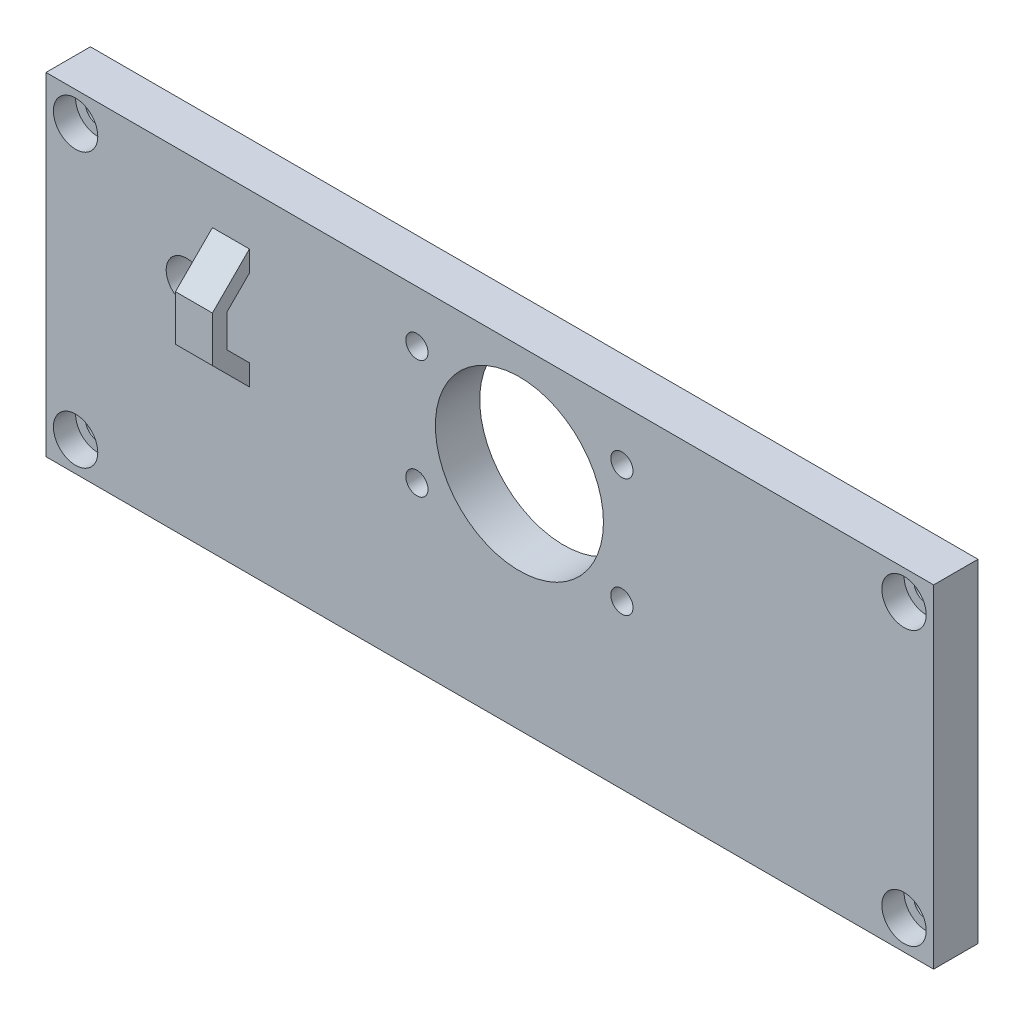
ISO-10303-21;
HEADER;
FILE_DESCRIPTION(('STEP AP214'),'2;1');
FILE_NAME('part.step','',(''),(''),'','','');
FILE_SCHEMA(('AUTOMOTIVE_DESIGN { 1 0 10303 214 1 1 1 1 }'));
ENDSEC;
DATA;
#1=APPLICATION_CONTEXT('core data for automotive mechanical design processes');
#2=APPLICATION_PROTOCOL_DEFINITION('international standard','automotive_design',2000,#1);
#3=PRODUCT_CONTEXT('',#1,'mechanical');
#4=PRODUCT('Part','Part','',(#3));
#5=PRODUCT_RELATED_PRODUCT_CATEGORY('part','',(#4));
#6=PRODUCT_DEFINITION_FORMATION('','',#4);
#7=PRODUCT_DEFINITION_CONTEXT('part definition',#1,'design');
#8=PRODUCT_DEFINITION('design','',#6,#7);
#9=PRODUCT_DEFINITION_SHAPE('','',#8);
#10=(LENGTH_UNIT() NAMED_UNIT(*) SI_UNIT(.MILLI.,.METRE.));
#11=(NAMED_UNIT(*) PLANE_ANGLE_UNIT() SI_UNIT($,.RADIAN.));
#12=(NAMED_UNIT(*) SI_UNIT($,.STERADIAN.) SOLID_ANGLE_UNIT());
#13=UNCERTAINTY_MEASURE_WITH_UNIT(LENGTH_MEASURE(1.E-05),#10,'distance_accuracy_value','');
#14=(GEOMETRIC_REPRESENTATION_CONTEXT(3) GLOBAL_UNCERTAINTY_ASSIGNED_CONTEXT((#13)) GLOBAL_UNIT_ASSIGNED_CONTEXT((#10,
#11,#12)) REPRESENTATION_CONTEXT('',''));
#15=CARTESIAN_POINT('',(0.,0.,0.));
#16=DIRECTION('',(0.,0.,1.));
#17=DIRECTION('',(1.,0.,0.));
#18=AXIS2_PLACEMENT_3D('',#15,#16,#17);
#19=CARTESIAN_POINT('',(0.,0.,6.));
#20=DIRECTION('',(0.,0.,-1.));
#21=DIRECTION('',(-1.,0.,0.));
#22=AXIS2_PLACEMENT_3D('',#19,#20,#21);
#23=PLANE('',#22);
#24=DIRECTION('',(0.,-1.,0.));
#25=VECTOR('',#24,1.);
#26=CARTESIAN_POINT('',(27.5,38.0784271247462,6.));
#27=LINE('',#26,#25);
#28=CARTESIAN_POINT('',(27.5,38.0784271247462,6.));
#29=VERTEX_POINT('',#28);
#30=CARTESIAN_POINT('',(27.5,35.25,6.));
#31=VERTEX_POINT('',#30);
#32=EDGE_CURVE('E151',#29,#31,#27,.T.);
#33=ORIENTED_EDGE('',*,*,#32,.T.);
#34=DIRECTION('',(-1.,0.,0.));
#35=VECTOR('',#34,1.);
#36=CARTESIAN_POINT('',(27.5,35.25,6.));
#37=LINE('',#36,#35);
#38=CARTESIAN_POINT('',(22.5,35.25,6.));
#39=VERTEX_POINT('',#38);
#40=EDGE_CURVE('E134',#31,#39,#37,.T.);
#41=ORIENTED_EDGE('',*,*,#40,.T.);
#42=DIRECTION('',(0.,-1.,0.));
#43=VECTOR('',#42,1.);
#44=CARTESIAN_POINT('',(22.5,38.0784271247462,6.));
#45=LINE('',#44,#43);
#46=CARTESIAN_POINT('',(22.5,38.0784271247462,6.));
#47=VERTEX_POINT('',#46);
#48=EDGE_CURVE('E176',#47,#39,#45,.T.);
#49=ORIENTED_EDGE('',*,*,#48,.F.);
#50=DIRECTION('',(-1.,0.,0.));
#51=VECTOR('',#50,1.);
#52=CARTESIAN_POINT('',(27.5,38.0784271247462,6.));
#53=LINE('',#52,#51);
#54=EDGE_CURVE('E158',#29,#47,#53,.T.);
#55=ORIENTED_EDGE('',*,*,#54,.F.);
#56=EDGE_LOOP('',(#33,#41,#49,#55));
#57=FACE_BOUND('',#56,.T.);
#58=CARTESIAN_POINT('',(19.,30.,6.));
#59=DIRECTION('',(0.,0.,1.));
#60=DIRECTION('',(1.,0.,0.));
#61=AXIS2_PLACEMENT_3D('',#58,#59,#60);
#62=CIRCLE('',#61,2.74999999999999);
#63=CARTESIAN_POINT('',(21.75,30.,6.));
#64=VERTEX_POINT('',#63);
#65=EDGE_CURVE('E189',#64,#64,#62,.T.);
#66=ORIENTED_EDGE('',*,*,#65,.F.);
#67=EDGE_LOOP('',(#66));
#68=FACE_BOUND('',#67,.T.);
#69=CARTESIAN_POINT('',(116.,41.,6.));
#70=DIRECTION('',(0.,0.,1.));
#71=DIRECTION('',(1.,0.,0.));
#72=AXIS2_PLACEMENT_3D('',#69,#70,#71);
#73=CIRCLE('',#72,3.00000000000001);
#74=CARTESIAN_POINT('',(119.,41.,6.));
#75=VERTEX_POINT('',#74);
#76=EDGE_CURVE('E229',#75,#75,#73,.T.);
#77=ORIENTED_EDGE('',*,*,#76,.F.);
#78=EDGE_LOOP('',(#77));
#79=FACE_BOUND('',#78,.T.);
#80=CARTESIAN_POINT('',(116.,4.,6.));
#81=DIRECTION('',(0.,0.,1.));
#82=DIRECTION('',(1.,0.,0.));
#83=AXIS2_PLACEMENT_3D('',#80,#81,#82);
#84=CIRCLE('',#83,3.00000000000001);
#85=CARTESIAN_POINT('',(119.,4.,6.));
#86=VERTEX_POINT('',#85);
#87=EDGE_CURVE('E220',#86,#86,#84,.T.);
#88=ORIENTED_EDGE('',*,*,#87,.F.);
#89=EDGE_LOOP('',(#88));
#90=FACE_BOUND('',#89,.T.);
#91=CARTESIAN_POINT('',(4.,4.,6.));
#92=DIRECTION('',(0.,0.,1.));
#93=DIRECTION('',(1.,0.,0.));
#94=AXIS2_PLACEMENT_3D('',#91,#92,#93);
#95=CIRCLE('',#94,3.);
#96=CARTESIAN_POINT('',(7.,4.,6.));
#97=VERTEX_POINT('',#96);
#98=EDGE_CURVE('E209',#97,#97,#95,.T.);
#99=ORIENTED_EDGE('',*,*,#98,.F.);
#100=EDGE_LOOP('',(#99));
#101=FACE_BOUND('',#100,.T.);
#102=CARTESIAN_POINT('',(4.,41.,6.));
#103=DIRECTION('',(0.,0.,1.));
#104=DIRECTION('',(1.,0.,0.));
#105=AXIS2_PLACEMENT_3D('',#102,#103,#104);
#106=CIRCLE('',#105,3.);
#107=CARTESIAN_POINT('',(7.,41.,6.));
#108=VERTEX_POINT('',#107);
#109=EDGE_CURVE('E238',#108,#108,#106,.T.);
#110=ORIENTED_EDGE('',*,*,#109,.F.);
#111=EDGE_LOOP('',(#110));
#112=FACE_BOUND('',#111,.T.);
#113=DIRECTION('',(0.,-1.,0.));
#114=VECTOR('',#113,1.);
#115=CARTESIAN_POINT('',(0.,0.,6.));
#116=LINE('',#115,#114);
#117=CARTESIAN_POINT('',(0.,45.,6.));
#118=VERTEX_POINT('',#117);
#119=CARTESIAN_POINT('',(0.,0.,6.));
#120=VERTEX_POINT('',#119);
#121=EDGE_CURVE('E287',#118,#120,#116,.T.);
#122=ORIENTED_EDGE('',*,*,#121,.T.);
#123=DIRECTION('',(1.,0.,0.));
#124=VECTOR('',#123,1.);
#125=CARTESIAN_POINT('',(0.,0.,6.));
#126=LINE('',#125,#124);
#127=CARTESIAN_POINT('',(120.,0.,6.));
#128=VERTEX_POINT('',#127);
#129=EDGE_CURVE('E290',#120,#128,#126,.T.);
#130=ORIENTED_EDGE('',*,*,#129,.T.);
#131=DIRECTION('',(0.,1.,0.));
#132=VECTOR('',#131,1.);
#133=CARTESIAN_POINT('',(120.,0.,6.));
#134=LINE('',#133,#132);
#135=CARTESIAN_POINT('',(120.,45.,6.));
#136=VERTEX_POINT('',#135);
#137=EDGE_CURVE('E293',#128,#136,#134,.T.);
#138=ORIENTED_EDGE('',*,*,#137,.T.);
#139=DIRECTION('',(-1.,0.,0.));
#140=VECTOR('',#139,1.);
#141=CARTESIAN_POINT('',(0.,45.,6.));
#142=LINE('',#141,#140);
#143=EDGE_CURVE('E295',#136,#118,#142,.T.);
#144=ORIENTED_EDGE('',*,*,#143,.T.);
#145=EDGE_LOOP('',(#122,#130,#138,#144));
#146=FACE_BOUND('',#145,.T.);
#147=CARTESIAN_POINT('',(64.,30.,6.));
#148=DIRECTION('',(0.,0.,1.));
#149=DIRECTION('',(1.,0.,0.));
#150=AXIS2_PLACEMENT_3D('',#147,#148,#149);
#151=CIRCLE('',#150,11.3625);
#152=CARTESIAN_POINT('',(75.3625,30.,6.));
#153=VERTEX_POINT('',#152);
#154=EDGE_CURVE('E281',#153,#153,#151,.T.);
#155=ORIENTED_EDGE('',*,*,#154,.F.);
#156=EDGE_LOOP('',(#155));
#157=FACE_BOUND('',#156,.T.);
#158=CARTESIAN_POINT('',(50.143593539449,38.,6.));
#159=DIRECTION('',(0.,0.,1.));
#160=DIRECTION('',(1.,0.,0.));
#161=AXIS2_PLACEMENT_3D('',#158,#159,#160);
#162=CIRCLE('',#161,1.5);
#163=CARTESIAN_POINT('',(51.643593539449,38.,6.));
#164=VERTEX_POINT('',#163);
#165=EDGE_CURVE('E263',#164,#164,#162,.T.);
#166=ORIENTED_EDGE('',*,*,#165,.F.);
#167=EDGE_LOOP('',(#166));
#168=FACE_BOUND('',#167,.T.);
#169=CARTESIAN_POINT('',(50.143593539449,22.,6.));
#170=DIRECTION('',(0.,0.,1.));
#171=DIRECTION('',(-1.,0.,0.));
#172=AXIS2_PLACEMENT_3D('',#169,#170,#171);
#173=CIRCLE('',#172,1.5);
#174=CARTESIAN_POINT('',(48.643593539449,22.,6.));
#175=VERTEX_POINT('',#174);
#176=EDGE_CURVE('E257',#175,#175,#173,.T.);
#177=ORIENTED_EDGE('',*,*,#176,.F.);
#178=EDGE_LOOP('',(#177));
#179=FACE_BOUND('',#178,.T.);
#180=CARTESIAN_POINT('',(77.856406460551,22.,6.));
#181=DIRECTION('',(0.,0.,1.));
#182=DIRECTION('',(1.,0.,0.));
#183=AXIS2_PLACEMENT_3D('',#180,#181,#182);
#184=CIRCLE('',#183,1.50000000000001);
#185=CARTESIAN_POINT('',(79.3564064605511,22.,6.));
#186=VERTEX_POINT('',#185);
#187=EDGE_CURVE('E251',#186,#186,#184,.T.);
#188=ORIENTED_EDGE('',*,*,#187,.F.);
#189=EDGE_LOOP('',(#188));
#190=FACE_BOUND('',#189,.T.);
#191=CARTESIAN_POINT('',(77.856406460551,38.,6.));
#192=DIRECTION('',(0.,0.,1.));
#193=DIRECTION('',(-1.,0.,0.));
#194=AXIS2_PLACEMENT_3D('',#191,#192,#193);
#195=CIRCLE('',#194,1.50000000000001);
#196=CARTESIAN_POINT('',(76.356406460551,38.,6.));
#197=VERTEX_POINT('',#196);
#198=EDGE_CURVE('E245',#197,#197,#195,.T.);
#199=ORIENTED_EDGE('',*,*,#198,.F.);
#200=EDGE_LOOP('',(#199));
#201=FACE_BOUND('',#200,.T.);
#202=DIRECTION('',(0.,-1.,0.));
#203=VECTOR('',#202,1.);
#204=CARTESIAN_POINT('',(27.5,24.75,6.));
#205=LINE('',#204,#203);
#206=CARTESIAN_POINT('',(27.5,24.75,6.));
#207=VERTEX_POINT('',#206);
#208=CARTESIAN_POINT('',(27.5,21.9215728752538,6.));
#209=VERTEX_POINT('',#208);
#210=EDGE_CURVE('E167',#207,#209,#205,.T.);
#211=ORIENTED_EDGE('',*,*,#210,.T.);
#212=DIRECTION('',(-1.,0.,0.));
#213=VECTOR('',#212,1.);
#214=CARTESIAN_POINT('',(27.5,21.9215728752538,6.));
#215=LINE('',#214,#213);
#216=CARTESIAN_POINT('',(22.5,21.9215728752538,6.));
#217=VERTEX_POINT('',#216);
#218=EDGE_CURVE('E195',#209,#217,#215,.T.);
#219=ORIENTED_EDGE('',*,*,#218,.T.);
#220=DIRECTION('',(0.,-1.,0.));
#221=VECTOR('',#220,1.);
#222=CARTESIAN_POINT('',(22.5,24.75,6.));
#223=LINE('',#222,#221);
#224=CARTESIAN_POINT('',(22.5,24.75,6.));
#225=VERTEX_POINT('',#224);
#226=EDGE_CURVE('E182',#225,#217,#223,.T.);
#227=ORIENTED_EDGE('',*,*,#226,.F.);
#228=DIRECTION('',(-1.,0.,0.));
#229=VECTOR('',#228,1.);
#230=CARTESIAN_POINT('',(27.5,24.75,6.));
#231=LINE('',#230,#229);
#232=EDGE_CURVE('E198',#207,#225,#231,.T.);
#233=ORIENTED_EDGE('',*,*,#232,.F.);
#234=EDGE_LOOP('',(#211,#219,#227,#233));
#235=FACE_BOUND('',#234,.T.);
#236=ADVANCED_FACE('F43',(#57,#68,#79,#90,#101,#112,#146,#157,#168,#179,#190,#201,#235),#23,.F.);
#237=CARTESIAN_POINT('',(4.,41.,6.));
#238=DIRECTION('',(0.,0.,-1.));
#239=DIRECTION('',(-1.,0.,0.));
#240=AXIS2_PLACEMENT_3D('',#237,#238,#239);
#241=CYLINDRICAL_SURFACE('',#240,1.65);
#242=CARTESIAN_POINT('',(4.,41.,0.));
#243=DIRECTION('',(0.,0.,1.));
#244=DIRECTION('',(1.,0.,0.));
#245=AXIS2_PLACEMENT_3D('',#242,#243,#244);
#246=CIRCLE('',#245,1.65);
#247=CARTESIAN_POINT('',(5.65,41.,0.));
#248=VERTEX_POINT('',#247);
#249=EDGE_CURVE('E277',#248,#248,#246,.T.);
#250=ORIENTED_EDGE('',*,*,#249,.F.);
#251=EDGE_LOOP('',(#250));
#252=FACE_BOUND('',#251,.T.);
#253=CARTESIAN_POINT('',(4.,41.,3.));
#254=DIRECTION('',(0.,0.,1.));
#255=DIRECTION('',(1.,0.,0.));
#256=AXIS2_PLACEMENT_3D('',#253,#254,#255);
#257=CIRCLE('',#256,1.65);
#258=CARTESIAN_POINT('',(5.65,41.,3.));
#259=VERTEX_POINT('',#258);
#260=EDGE_CURVE('E219',#259,#259,#257,.T.);
#261=ORIENTED_EDGE('',*,*,#260,.T.);
#262=EDGE_LOOP('',(#261));
#263=FACE_BOUND('',#262,.T.);
#264=ADVANCED_FACE('F339',(#252,#263),#241,.F.);
#265=CARTESIAN_POINT('',(4.,4.,6.));
#266=DIRECTION('',(0.,0.,-1.));
#267=DIRECTION('',(-1.,0.,0.));
#268=AXIS2_PLACEMENT_3D('',#265,#266,#267);
#269=CYLINDRICAL_SURFACE('',#268,1.65);
#270=CARTESIAN_POINT('',(4.,4.,0.));
#271=DIRECTION('',(0.,0.,1.));
#272=DIRECTION('',(-1.,0.,0.));
#273=AXIS2_PLACEMENT_3D('',#270,#271,#272);
#274=CIRCLE('',#273,1.65);
#275=CARTESIAN_POINT('',(2.35,4.,0.));
#276=VERTEX_POINT('',#275);
#277=EDGE_CURVE('E274',#276,#276,#274,.T.);
#278=ORIENTED_EDGE('',*,*,#277,.F.);
#279=EDGE_LOOP('',(#278));
#280=FACE_BOUND('',#279,.T.);
#281=CARTESIAN_POINT('',(4.,4.,3.));
#282=DIRECTION('',(0.,0.,1.));
#283=DIRECTION('',(1.,0.,0.));
#284=AXIS2_PLACEMENT_3D('',#281,#282,#283);
#285=CIRCLE('',#284,1.65);
#286=CARTESIAN_POINT('',(5.65,4.,3.));
#287=VERTEX_POINT('',#286);
#288=EDGE_CURVE('E212',#287,#287,#285,.T.);
#289=ORIENTED_EDGE('',*,*,#288,.T.);
#290=EDGE_LOOP('',(#289));
#291=FACE_BOUND('',#290,.T.);
#292=ADVANCED_FACE('F346',(#280,#291),#269,.F.);
#293=CARTESIAN_POINT('',(116.,41.,6.));
#294=DIRECTION('',(0.,0.,-1.));
#295=DIRECTION('',(-1.,0.,0.));
#296=AXIS2_PLACEMENT_3D('',#293,#294,#295);
#297=CYLINDRICAL_SURFACE('',#296,1.65);
#298=CARTESIAN_POINT('',(116.,41.,0.));
#299=DIRECTION('',(0.,0.,1.));
#300=DIRECTION('',(-1.,0.,0.));
#301=AXIS2_PLACEMENT_3D('',#298,#299,#300);
#302=CIRCLE('',#301,1.65);
#303=CARTESIAN_POINT('',(114.35,41.,0.));
#304=VERTEX_POINT('',#303);
#305=EDGE_CURVE('E271',#304,#304,#302,.T.);
#306=ORIENTED_EDGE('',*,*,#305,.F.);
#307=EDGE_LOOP('',(#306));
#308=FACE_BOUND('',#307,.T.);
#309=CARTESIAN_POINT('',(116.,41.,3.));
#310=DIRECTION('',(0.,0.,1.));
#311=DIRECTION('',(1.,0.,0.));
#312=AXIS2_PLACEMENT_3D('',#309,#310,#311);
#313=CIRCLE('',#312,1.65);
#314=CARTESIAN_POINT('',(117.65,41.,3.));
#315=VERTEX_POINT('',#314);
#316=EDGE_CURVE('E226',#315,#315,#313,.T.);
#317=ORIENTED_EDGE('',*,*,#316,.T.);
#318=EDGE_LOOP('',(#317));
#319=FACE_BOUND('',#318,.T.);
#320=ADVANCED_FACE('F404',(#308,#319),#297,.F.);
#321=CARTESIAN_POINT('',(116.,4.,6.));
#322=DIRECTION('',(0.,0.,-1.));
#323=DIRECTION('',(-1.,0.,0.));
#324=AXIS2_PLACEMENT_3D('',#321,#322,#323);
#325=CYLINDRICAL_SURFACE('',#324,1.65);
#326=CARTESIAN_POINT('',(116.,4.,0.));
#327=DIRECTION('',(0.,0.,1.));
#328=DIRECTION('',(1.,0.,0.));
#329=AXIS2_PLACEMENT_3D('',#326,#327,#328);
#330=CIRCLE('',#329,1.65);
#331=CARTESIAN_POINT('',(117.65,4.,0.));
#332=VERTEX_POINT('',#331);
#333=EDGE_CURVE('E266',#332,#332,#330,.T.);
#334=ORIENTED_EDGE('',*,*,#333,.F.);
#335=EDGE_LOOP('',(#334));
#336=FACE_BOUND('',#335,.T.);
#337=CARTESIAN_POINT('',(116.,4.,3.));
#338=DIRECTION('',(0.,0.,1.));
#339=DIRECTION('',(1.,0.,0.));
#340=AXIS2_PLACEMENT_3D('',#337,#338,#339);
#341=CIRCLE('',#340,1.65);
#342=CARTESIAN_POINT('',(117.65,4.,3.));
#343=VERTEX_POINT('',#342);
#344=EDGE_CURVE('E216',#343,#343,#341,.T.);
#345=ORIENTED_EDGE('',*,*,#344,.T.);
#346=EDGE_LOOP('',(#345));
#347=FACE_BOUND('',#346,.T.);
#348=ADVANCED_FACE('F354',(#336,#347),#325,.F.);
#349=CARTESIAN_POINT('',(0.,0.,0.));
#350=DIRECTION('',(0.,0.,-1.));
#351=DIRECTION('',(-1.,0.,0.));
#352=AXIS2_PLACEMENT_3D('',#349,#350,#351);
#353=PLANE('',#352);
#354=CARTESIAN_POINT('',(19.,30.,0.));
#355=DIRECTION('',(0.,0.,1.));
#356=DIRECTION('',(1.,0.,0.));
#357=AXIS2_PLACEMENT_3D('',#354,#355,#356);
#358=CIRCLE('',#357,2.74999999999999);
#359=CARTESIAN_POINT('',(21.75,30.,0.));
#360=VERTEX_POINT('',#359);
#361=EDGE_CURVE('E203',#360,#360,#358,.T.);
#362=ORIENTED_EDGE('',*,*,#361,.T.);
#363=EDGE_LOOP('',(#362));
#364=FACE_BOUND('',#363,.T.);
#365=CARTESIAN_POINT('',(77.856406460551,22.,0.));
#366=DIRECTION('',(0.,0.,1.));
#367=DIRECTION('',(1.,0.,0.));
#368=AXIS2_PLACEMENT_3D('',#365,#366,#367);
#369=CIRCLE('',#368,1.50000000000001);
#370=CARTESIAN_POINT('',(79.3564064605511,22.,0.));
#371=VERTEX_POINT('',#370);
#372=EDGE_CURVE('E248',#371,#371,#369,.T.);
#373=ORIENTED_EDGE('',*,*,#372,.T.);
#374=EDGE_LOOP('',(#373));
#375=FACE_BOUND('',#374,.T.);
#376=CARTESIAN_POINT('',(50.143593539449,38.,0.));
#377=DIRECTION('',(0.,0.,1.));
#378=DIRECTION('',(1.,0.,0.));
#379=AXIS2_PLACEMENT_3D('',#376,#377,#378);
#380=CIRCLE('',#379,1.5);
#381=CARTESIAN_POINT('',(51.643593539449,38.,0.));
#382=VERTEX_POINT('',#381);
#383=EDGE_CURVE('E260',#382,#382,#380,.T.);
#384=ORIENTED_EDGE('',*,*,#383,.T.);
#385=EDGE_LOOP('',(#384));
#386=FACE_BOUND('',#385,.T.);
#387=ORIENTED_EDGE('',*,*,#305,.T.);
#388=EDGE_LOOP('',(#387));
#389=FACE_BOUND('',#388,.T.);
#390=ORIENTED_EDGE('',*,*,#249,.T.);
#391=EDGE_LOOP('',(#390));
#392=FACE_BOUND('',#391,.T.);
#393=DIRECTION('',(0.,-1.,0.));
#394=VECTOR('',#393,1.);
#395=CARTESIAN_POINT('',(0.,0.,0.));
#396=LINE('',#395,#394);
#397=CARTESIAN_POINT('',(0.,45.,0.));
#398=VERTEX_POINT('',#397);
#399=CARTESIAN_POINT('',(0.,0.,0.));
#400=VERTEX_POINT('',#399);
#401=EDGE_CURVE('E284',#398,#400,#396,.T.);
#402=ORIENTED_EDGE('',*,*,#401,.F.);
#403=DIRECTION('',(-1.,0.,0.));
#404=VECTOR('',#403,1.);
#405=CARTESIAN_POINT('',(0.,45.,0.));
#406=LINE('',#405,#404);
#407=CARTESIAN_POINT('',(120.,45.,0.));
#408=VERTEX_POINT('',#407);
#409=EDGE_CURVE('E291',#408,#398,#406,.T.);
#410=ORIENTED_EDGE('',*,*,#409,.F.);
#411=DIRECTION('',(0.,1.,0.));
#412=VECTOR('',#411,1.);
#413=CARTESIAN_POINT('',(120.,0.,0.));
#414=LINE('',#413,#412);
#415=CARTESIAN_POINT('',(120.,0.,0.));
#416=VERTEX_POINT('',#415);
#417=EDGE_CURVE('E302',#416,#408,#414,.T.);
#418=ORIENTED_EDGE('',*,*,#417,.F.);
#419=DIRECTION('',(1.,0.,0.));
#420=VECTOR('',#419,1.);
#421=CARTESIAN_POINT('',(0.,0.,0.));
#422=LINE('',#421,#420);
#423=EDGE_CURVE('E300',#400,#416,#422,.T.);
#424=ORIENTED_EDGE('',*,*,#423,.F.);
#425=EDGE_LOOP('',(#402,#410,#418,#424));
#426=FACE_BOUND('',#425,.T.);
#427=CARTESIAN_POINT('',(64.,30.,0.));
#428=DIRECTION('',(0.,0.,1.));
#429=DIRECTION('',(1.,0.,0.));
#430=AXIS2_PLACEMENT_3D('',#427,#428,#429);
#431=CIRCLE('',#430,11.3625);
#432=CARTESIAN_POINT('',(75.3625,30.,0.));
#433=VERTEX_POINT('',#432);
#434=EDGE_CURVE('E280',#433,#433,#431,.T.);
#435=ORIENTED_EDGE('',*,*,#434,.T.);
#436=EDGE_LOOP('',(#435));
#437=FACE_BOUND('',#436,.T.);
#438=ORIENTED_EDGE('',*,*,#277,.T.);
#439=EDGE_LOOP('',(#438));
#440=FACE_BOUND('',#439,.T.);
#441=ORIENTED_EDGE('',*,*,#333,.T.);
#442=EDGE_LOOP('',(#441));
#443=FACE_BOUND('',#442,.T.);
#444=CARTESIAN_POINT('',(50.143593539449,22.,0.));
#445=DIRECTION('',(0.,0.,1.));
#446=DIRECTION('',(-1.,0.,0.));
#447=AXIS2_PLACEMENT_3D('',#444,#445,#446);
#448=CIRCLE('',#447,1.5);
#449=CARTESIAN_POINT('',(48.643593539449,22.,0.));
#450=VERTEX_POINT('',#449);
#451=EDGE_CURVE('E254',#450,#450,#448,.T.);
#452=ORIENTED_EDGE('',*,*,#451,.T.);
#453=EDGE_LOOP('',(#452));
#454=FACE_BOUND('',#453,.T.);
#455=CARTESIAN_POINT('',(77.856406460551,38.,0.));
#456=DIRECTION('',(0.,0.,1.));
#457=DIRECTION('',(-1.,0.,0.));
#458=AXIS2_PLACEMENT_3D('',#455,#456,#457);
#459=CIRCLE('',#458,1.50000000000001);
#460=CARTESIAN_POINT('',(76.356406460551,38.,0.));
#461=VERTEX_POINT('',#460);
#462=EDGE_CURVE('E242',#461,#461,#459,.T.);
#463=ORIENTED_EDGE('',*,*,#462,.T.);
#464=EDGE_LOOP('',(#463));
#465=FACE_BOUND('',#464,.T.);
#466=ADVANCED_FACE('F320',(#364,#375,#386,#389,#392,#426,#437,#440,#443,#454,#465),#353,.T.);
#467=CARTESIAN_POINT('',(0.,0.,6.));
#468=DIRECTION('',(1.,0.,0.));
#469=DIRECTION('',(0.,0.,-1.));
#470=AXIS2_PLACEMENT_3D('',#467,#468,#469);
#471=PLANE('',#470);
#472=ORIENTED_EDGE('',*,*,#401,.T.);
#473=DIRECTION('',(0.,0.,-1.));
#474=VECTOR('',#473,1.);
#475=CARTESIAN_POINT('',(0.,0.,6.));
#476=LINE('',#475,#474);
#477=EDGE_CURVE('E11',#120,#400,#476,.T.);
#478=ORIENTED_EDGE('',*,*,#477,.F.);
#479=ORIENTED_EDGE('',*,*,#121,.F.);
#480=DIRECTION('',(0.,0.,-1.));
#481=VECTOR('',#480,1.);
#482=CARTESIAN_POINT('',(0.,45.,6.));
#483=LINE('',#482,#481);
#484=EDGE_CURVE('E297',#118,#398,#483,.T.);
#485=ORIENTED_EDGE('',*,*,#484,.T.);
#486=EDGE_LOOP('',(#472,#478,#479,#485));
#487=FACE_BOUND('',#486,.T.);
#488=ADVANCED_FACE('F45',(#487),#471,.F.);
#489=CARTESIAN_POINT('',(0.,0.,6.));
#490=DIRECTION('',(0.,1.,0.));
#491=DIRECTION('',(0.,0.,1.));
#492=AXIS2_PLACEMENT_3D('',#489,#490,#491);
#493=PLANE('',#492);
#494=ORIENTED_EDGE('',*,*,#423,.T.);
#495=DIRECTION('',(0.,0.,-1.));
#496=VECTOR('',#495,1.);
#497=CARTESIAN_POINT('',(120.,0.,6.));
#498=LINE('',#497,#496);
#499=EDGE_CURVE('E51',#128,#416,#498,.T.);
#500=ORIENTED_EDGE('',*,*,#499,.F.);
#501=ORIENTED_EDGE('',*,*,#129,.F.);
#502=ORIENTED_EDGE('',*,*,#477,.T.);
#503=EDGE_LOOP('',(#494,#500,#501,#502));
#504=FACE_BOUND('',#503,.T.);
#505=ADVANCED_FACE('F331',(#504),#493,.F.);
#506=CARTESIAN_POINT('',(120.,0.,6.));
#507=DIRECTION('',(-1.,0.,0.));
#508=DIRECTION('',(0.,0.,1.));
#509=AXIS2_PLACEMENT_3D('',#506,#507,#508);
#510=PLANE('',#509);
#511=ORIENTED_EDGE('',*,*,#417,.T.);
#512=DIRECTION('',(0.,0.,-1.));
#513=VECTOR('',#512,1.);
#514=CARTESIAN_POINT('',(120.,45.,6.));
#515=LINE('',#514,#513);
#516=EDGE_CURVE('E307',#136,#408,#515,.T.);
#517=ORIENTED_EDGE('',*,*,#516,.F.);
#518=ORIENTED_EDGE('',*,*,#137,.F.);
#519=ORIENTED_EDGE('',*,*,#499,.T.);
#520=EDGE_LOOP('',(#511,#517,#518,#519));
#521=FACE_BOUND('',#520,.T.);
#522=ADVANCED_FACE('F314',(#521),#510,.F.);
#523=CARTESIAN_POINT('',(0.,45.,6.));
#524=DIRECTION('',(0.,-1.,0.));
#525=DIRECTION('',(0.,0.,-1.));
#526=AXIS2_PLACEMENT_3D('',#523,#524,#525);
#527=PLANE('',#526);
#528=ORIENTED_EDGE('',*,*,#409,.T.);
#529=ORIENTED_EDGE('',*,*,#484,.F.);
#530=ORIENTED_EDGE('',*,*,#143,.F.);
#531=ORIENTED_EDGE('',*,*,#516,.T.);
#532=EDGE_LOOP('',(#528,#529,#530,#531));
#533=FACE_BOUND('',#532,.T.);
#534=ADVANCED_FACE('F324',(#533),#527,.F.);
#535=CARTESIAN_POINT('',(64.,30.,6.));
#536=DIRECTION('',(0.,0.,-1.));
#537=DIRECTION('',(-1.,0.,0.));
#538=AXIS2_PLACEMENT_3D('',#535,#536,#537);
#539=CYLINDRICAL_SURFACE('',#538,11.3625);
#540=ORIENTED_EDGE('',*,*,#154,.T.);
#541=EDGE_LOOP('',(#540));
#542=FACE_BOUND('',#541,.T.);
#543=ORIENTED_EDGE('',*,*,#434,.F.);
#544=EDGE_LOOP('',(#543));
#545=FACE_BOUND('',#544,.T.);
#546=ADVANCED_FACE('F351',(#542,#545),#539,.F.);
#547=CARTESIAN_POINT('',(50.143593539449,38.,6.));
#548=DIRECTION('',(0.,0.,-1.));
#549=DIRECTION('',(-1.,0.,0.));
#550=AXIS2_PLACEMENT_3D('',#547,#548,#549);
#551=CYLINDRICAL_SURFACE('',#550,1.5);
#552=ORIENTED_EDGE('',*,*,#165,.T.);
#553=EDGE_LOOP('',(#552));
#554=FACE_BOUND('',#553,.T.);
#555=ORIENTED_EDGE('',*,*,#383,.F.);
#556=EDGE_LOOP('',(#555));
#557=FACE_BOUND('',#556,.T.);
#558=ADVANCED_FACE('F360',(#554,#557),#551,.F.);
#559=CARTESIAN_POINT('',(50.143593539449,22.,6.));
#560=DIRECTION('',(0.,0.,-1.));
#561=DIRECTION('',(-1.,0.,0.));
#562=AXIS2_PLACEMENT_3D('',#559,#560,#561);
#563=CYLINDRICAL_SURFACE('',#562,1.5);
#564=ORIENTED_EDGE('',*,*,#176,.T.);
#565=EDGE_LOOP('',(#564));
#566=FACE_BOUND('',#565,.T.);
#567=ORIENTED_EDGE('',*,*,#451,.F.);
#568=EDGE_LOOP('',(#567));
#569=FACE_BOUND('',#568,.T.);
#570=ADVANCED_FACE('F365',(#566,#569),#563,.F.);
#571=CARTESIAN_POINT('',(77.856406460551,22.,6.));
#572=DIRECTION('',(0.,0.,-1.));
#573=DIRECTION('',(-1.,0.,0.));
#574=AXIS2_PLACEMENT_3D('',#571,#572,#573);
#575=CYLINDRICAL_SURFACE('',#574,1.50000000000001);
#576=ORIENTED_EDGE('',*,*,#187,.T.);
#577=EDGE_LOOP('',(#576));
#578=FACE_BOUND('',#577,.T.);
#579=ORIENTED_EDGE('',*,*,#372,.F.);
#580=EDGE_LOOP('',(#579));
#581=FACE_BOUND('',#580,.T.);
#582=ADVANCED_FACE('F383',(#578,#581),#575,.F.);
#583=CARTESIAN_POINT('',(77.856406460551,38.,6.));
#584=DIRECTION('',(0.,0.,-1.));
#585=DIRECTION('',(-1.,0.,0.));
#586=AXIS2_PLACEMENT_3D('',#583,#584,#585);
#587=CYLINDRICAL_SURFACE('',#586,1.50000000000001);
#588=ORIENTED_EDGE('',*,*,#198,.T.);
#589=EDGE_LOOP('',(#588));
#590=FACE_BOUND('',#589,.T.);
#591=ORIENTED_EDGE('',*,*,#462,.F.);
#592=EDGE_LOOP('',(#591));
#593=FACE_BOUND('',#592,.T.);
#594=ADVANCED_FACE('F380',(#590,#593),#587,.F.);
#595=CARTESIAN_POINT('',(116.,4.,3.));
#596=DIRECTION('',(0.,0.,1.));
#597=DIRECTION('',(1.,0.,0.));
#598=AXIS2_PLACEMENT_3D('',#595,#596,#597);
#599=CYLINDRICAL_SURFACE('',#598,3.00000000000001);
#600=CARTESIAN_POINT('',(116.,4.,3.));
#601=DIRECTION('',(0.,0.,1.));
#602=DIRECTION('',(1.,0.,0.));
#603=AXIS2_PLACEMENT_3D('',#600,#601,#602);
#604=CIRCLE('',#603,3.00000000000001);
#605=CARTESIAN_POINT('',(119.,4.,3.));
#606=VERTEX_POINT('',#605);
#607=EDGE_CURVE('E223',#606,#606,#604,.T.);
#608=ORIENTED_EDGE('',*,*,#607,.F.);
#609=EDGE_LOOP('',(#608));
#610=FACE_BOUND('',#609,.T.);
#611=ORIENTED_EDGE('',*,*,#87,.T.);
#612=EDGE_LOOP('',(#611));
#613=FACE_BOUND('',#612,.T.);
#614=ADVANCED_FACE('F382',(#610,#613),#599,.F.);
#615=CARTESIAN_POINT('',(116.,4.,3.));
#616=DIRECTION('',(0.,0.,1.));
#617=DIRECTION('',(1.,0.,0.));
#618=AXIS2_PLACEMENT_3D('',#615,#616,#617);
#619=PLANE('',#618);
#620=ORIENTED_EDGE('',*,*,#344,.F.);
#621=EDGE_LOOP('',(#620));
#622=FACE_BOUND('',#621,.T.);
#623=ORIENTED_EDGE('',*,*,#607,.T.);
#624=EDGE_LOOP('',(#623));
#625=FACE_BOUND('',#624,.T.);
#626=ADVANCED_FACE('F390',(#622,#625),#619,.T.);
#627=CARTESIAN_POINT('',(116.,41.,3.));
#628=DIRECTION('',(0.,0.,1.));
#629=DIRECTION('',(1.,0.,0.));
#630=AXIS2_PLACEMENT_3D('',#627,#628,#629);
#631=CYLINDRICAL_SURFACE('',#630,3.00000000000001);
#632=CARTESIAN_POINT('',(116.,41.,3.));
#633=DIRECTION('',(0.,0.,1.));
#634=DIRECTION('',(1.,0.,0.));
#635=AXIS2_PLACEMENT_3D('',#632,#633,#634);
#636=CIRCLE('',#635,3.00000000000001);
#637=CARTESIAN_POINT('',(119.,41.,3.));
#638=VERTEX_POINT('',#637);
#639=EDGE_CURVE('E206',#638,#638,#636,.T.);
#640=ORIENTED_EDGE('',*,*,#639,.F.);
#641=EDGE_LOOP('',(#640));
#642=FACE_BOUND('',#641,.T.);
#643=ORIENTED_EDGE('',*,*,#76,.T.);
#644=EDGE_LOOP('',(#643));
#645=FACE_BOUND('',#644,.T.);
#646=ADVANCED_FACE('F452',(#642,#645),#631,.F.);
#647=CARTESIAN_POINT('',(116.,41.,3.));
#648=DIRECTION('',(0.,0.,1.));
#649=DIRECTION('',(1.,0.,0.));
#650=AXIS2_PLACEMENT_3D('',#647,#648,#649);
#651=PLANE('',#650);
#652=ORIENTED_EDGE('',*,*,#316,.F.);
#653=EDGE_LOOP('',(#652));
#654=FACE_BOUND('',#653,.T.);
#655=ORIENTED_EDGE('',*,*,#639,.T.);
#656=EDGE_LOOP('',(#655));
#657=FACE_BOUND('',#656,.T.);
#658=ADVANCED_FACE('F425',(#654,#657),#651,.T.);
#659=CARTESIAN_POINT('',(4.,4.,3.));
#660=DIRECTION('',(0.,0.,1.));
#661=DIRECTION('',(1.,0.,0.));
#662=AXIS2_PLACEMENT_3D('',#659,#660,#661);
#663=CYLINDRICAL_SURFACE('',#662,3.);
#664=CARTESIAN_POINT('',(4.,4.,3.));
#665=DIRECTION('',(0.,0.,1.));
#666=DIRECTION('',(1.,0.,0.));
#667=AXIS2_PLACEMENT_3D('',#664,#665,#666);
#668=CIRCLE('',#667,3.);
#669=CARTESIAN_POINT('',(7.,4.,3.));
#670=VERTEX_POINT('',#669);
#671=EDGE_CURVE('E213',#670,#670,#668,.T.);
#672=ORIENTED_EDGE('',*,*,#671,.F.);
#673=EDGE_LOOP('',(#672));
#674=FACE_BOUND('',#673,.T.);
#675=ORIENTED_EDGE('',*,*,#98,.T.);
#676=EDGE_LOOP('',(#675));
#677=FACE_BOUND('',#676,.T.);
#678=ADVANCED_FACE('F419',(#674,#677),#663,.F.);
#679=CARTESIAN_POINT('',(4.,4.,3.));
#680=DIRECTION('',(0.,0.,1.));
#681=DIRECTION('',(1.,0.,0.));
#682=AXIS2_PLACEMENT_3D('',#679,#680,#681);
#683=PLANE('',#682);
#684=ORIENTED_EDGE('',*,*,#288,.F.);
#685=EDGE_LOOP('',(#684));
#686=FACE_BOUND('',#685,.T.);
#687=ORIENTED_EDGE('',*,*,#671,.T.);
#688=EDGE_LOOP('',(#687));
#689=FACE_BOUND('',#688,.T.);
#690=ADVANCED_FACE('F416',(#686,#689),#683,.T.);
#691=CARTESIAN_POINT('',(4.,41.,3.));
#692=DIRECTION('',(0.,0.,1.));
#693=DIRECTION('',(1.,0.,0.));
#694=AXIS2_PLACEMENT_3D('',#691,#692,#693);
#695=CYLINDRICAL_SURFACE('',#694,3.);
#696=CARTESIAN_POINT('',(4.,41.,3.));
#697=DIRECTION('',(0.,0.,1.));
#698=DIRECTION('',(1.,0.,0.));
#699=AXIS2_PLACEMENT_3D('',#696,#697,#698);
#700=CIRCLE('',#699,3.);
#701=CARTESIAN_POINT('',(7.,41.,3.));
#702=VERTEX_POINT('',#701);
#703=EDGE_CURVE('E239',#702,#702,#700,.T.);
#704=ORIENTED_EDGE('',*,*,#703,.F.);
#705=EDGE_LOOP('',(#704));
#706=FACE_BOUND('',#705,.T.);
#707=ORIENTED_EDGE('',*,*,#109,.T.);
#708=EDGE_LOOP('',(#707));
#709=FACE_BOUND('',#708,.T.);
#710=ADVANCED_FACE('F396',(#706,#709),#695,.F.);
#711=CARTESIAN_POINT('',(4.,41.,3.));
#712=DIRECTION('',(0.,0.,1.));
#713=DIRECTION('',(1.,0.,0.));
#714=AXIS2_PLACEMENT_3D('',#711,#712,#713);
#715=PLANE('',#714);
#716=ORIENTED_EDGE('',*,*,#260,.F.);
#717=EDGE_LOOP('',(#716));
#718=FACE_BOUND('',#717,.T.);
#719=ORIENTED_EDGE('',*,*,#703,.T.);
#720=EDGE_LOOP('',(#719));
#721=FACE_BOUND('',#720,.T.);
#722=ADVANCED_FACE('F433',(#718,#721),#715,.T.);
#723=CARTESIAN_POINT('',(19.,30.,0.));
#724=DIRECTION('',(0.,0.,1.));
#725=DIRECTION('',(1.,0.,0.));
#726=AXIS2_PLACEMENT_3D('',#723,#724,#725);
#727=CYLINDRICAL_SURFACE('',#726,2.74999999999999);
#728=ORIENTED_EDGE('',*,*,#361,.F.);
#729=EDGE_LOOP('',(#728));
#730=FACE_BOUND('',#729,.T.);
#731=ORIENTED_EDGE('',*,*,#65,.T.);
#732=EDGE_LOOP('',(#731));
#733=FACE_BOUND('',#732,.T.);
#734=ADVANCED_FACE('F438',(#730,#733),#727,.F.);
#735=CARTESIAN_POINT('',(27.5,36.6642135623731,7.41421356237309));
#736=DIRECTION('',(0.,0.707106781186548,0.707106781186547));
#737=DIRECTION('',(0.,-0.707106781186547,0.707106781186548));
#738=AXIS2_PLACEMENT_3D('',#735,#736,#737);
#739=PLANE('',#738);
#740=DIRECTION('',(0.,0.707106781186547,-0.707106781186548));
#741=VECTOR('',#740,1.);
#742=CARTESIAN_POINT('',(22.5,36.6642135623731,7.41421356237309));
#743=LINE('',#742,#741);
#744=CARTESIAN_POINT('',(22.5,33.0784271247462,11.));
#745=VERTEX_POINT('',#744);
#746=EDGE_CURVE('E65',#745,#47,#743,.T.);
#747=ORIENTED_EDGE('',*,*,#746,.F.);
#748=DIRECTION('',(-1.,0.,0.));
#749=VECTOR('',#748,1.);
#750=CARTESIAN_POINT('',(27.5,33.0784271247462,11.));
#751=LINE('',#750,#749);
#752=CARTESIAN_POINT('',(27.5,33.0784271247462,11.));
#753=VERTEX_POINT('',#752);
#754=EDGE_CURVE('E190',#753,#745,#751,.T.);
#755=ORIENTED_EDGE('',*,*,#754,.F.);
#756=DIRECTION('',(0.,0.707106781186546,-0.707106781186549));
#757=VECTOR('',#756,1.);
#758=CARTESIAN_POINT('',(27.5,36.6642135623731,7.41421356237309));
#759=LINE('',#758,#757);
#760=EDGE_CURVE('E144',#753,#29,#759,.T.);
#761=ORIENTED_EDGE('',*,*,#760,.T.);
#762=ORIENTED_EDGE('',*,*,#54,.T.);
#763=EDGE_LOOP('',(#747,#755,#761,#762));
#764=FACE_BOUND('',#763,.T.);
#765=ADVANCED_FACE('F445',(#764),#739,.T.);
#766=CARTESIAN_POINT('',(27.5,33.0784271247462,11.));
#767=DIRECTION('',(0.,0.,1.));
#768=DIRECTION('',(1.,0.,0.));
#769=AXIS2_PLACEMENT_3D('',#766,#767,#768);
#770=PLANE('',#769);
#771=DIRECTION('',(0.,1.,0.));
#772=VECTOR('',#771,1.);
#773=CARTESIAN_POINT('',(22.5,33.0784271247462,11.));
#774=LINE('',#773,#772);
#775=CARTESIAN_POINT('',(22.5,26.9215728752538,11.));
#776=VERTEX_POINT('',#775);
#777=EDGE_CURVE('E160',#776,#745,#774,.T.);
#778=ORIENTED_EDGE('',*,*,#777,.F.);
#779=DIRECTION('',(-1.,0.,0.));
#780=VECTOR('',#779,1.);
#781=CARTESIAN_POINT('',(27.5,26.9215728752538,11.));
#782=LINE('',#781,#780);
#783=CARTESIAN_POINT('',(27.5,26.9215728752538,11.));
#784=VERTEX_POINT('',#783);
#785=EDGE_CURVE('E193',#784,#776,#782,.T.);
#786=ORIENTED_EDGE('',*,*,#785,.F.);
#787=DIRECTION('',(0.,1.,0.));
#788=VECTOR('',#787,1.);
#789=CARTESIAN_POINT('',(27.5,33.0784271247462,11.));
#790=LINE('',#789,#788);
#791=EDGE_CURVE('E172',#784,#753,#790,.T.);
#792=ORIENTED_EDGE('',*,*,#791,.T.);
#793=ORIENTED_EDGE('',*,*,#754,.T.);
#794=EDGE_LOOP('',(#778,#786,#792,#793));
#795=FACE_BOUND('',#794,.T.);
#796=ADVANCED_FACE('F473',(#795),#770,.T.);
#797=CARTESIAN_POINT('',(27.5,26.9215728752538,11.));
#798=DIRECTION('',(0.,-0.707106781186548,0.707106781186546));
#799=DIRECTION('',(0.,-0.707106781186547,-0.707106781186549));
#800=AXIS2_PLACEMENT_3D('',#797,#798,#799);
#801=PLANE('',#800);
#802=DIRECTION('',(0.,0.707106781186546,0.707106781186548));
#803=VECTOR('',#802,1.);
#804=CARTESIAN_POINT('',(22.5,26.9215728752538,11.));
#805=LINE('',#804,#803);
#806=EDGE_CURVE('E184',#217,#776,#805,.T.);
#807=ORIENTED_EDGE('',*,*,#806,.F.);
#808=ORIENTED_EDGE('',*,*,#218,.F.);
#809=DIRECTION('',(0.,0.70710678118655,0.707106781186545));
#810=VECTOR('',#809,1.);
#811=CARTESIAN_POINT('',(27.5,23.3357864376269,7.4142135623731));
#812=LINE('',#811,#810);
#813=EDGE_CURVE('E170',#209,#784,#812,.T.);
#814=ORIENTED_EDGE('',*,*,#813,.T.);
#815=ORIENTED_EDGE('',*,*,#785,.T.);
#816=EDGE_LOOP('',(#807,#808,#814,#815));
#817=FACE_BOUND('',#816,.T.);
#818=ADVANCED_FACE('F469',(#817),#801,.T.);
#819=CARTESIAN_POINT('',(27.5,27.75,9.));
#820=DIRECTION('',(0.,0.70710678118655,-0.707106781186545));
#821=DIRECTION('',(0.,0.707106781186545,0.70710678118655));
#822=AXIS2_PLACEMENT_3D('',#819,#820,#821);
#823=PLANE('',#822);
#824=DIRECTION('',(0.,-0.707106781186545,-0.70710678118655));
#825=VECTOR('',#824,1.);
#826=CARTESIAN_POINT('',(22.5,27.75,9.));
#827=LINE('',#826,#825);
#828=CARTESIAN_POINT('',(22.5,27.75,9.));
#829=VERTEX_POINT('',#828);
#830=EDGE_CURVE('E58',#829,#225,#827,.T.);
#831=ORIENTED_EDGE('',*,*,#830,.F.);
#832=DIRECTION('',(-1.,0.,0.));
#833=VECTOR('',#832,1.);
#834=CARTESIAN_POINT('',(27.5,27.75,9.));
#835=LINE('',#834,#833);
#836=CARTESIAN_POINT('',(27.5,27.75,9.));
#837=VERTEX_POINT('',#836);
#838=EDGE_CURVE('E200',#837,#829,#835,.T.);
#839=ORIENTED_EDGE('',*,*,#838,.F.);
#840=DIRECTION('',(0.,-0.707106781186545,-0.70710678118655));
#841=VECTOR('',#840,1.);
#842=CARTESIAN_POINT('',(27.5,27.75,9.));
#843=LINE('',#842,#841);
#844=EDGE_CURVE('E164',#837,#207,#843,.T.);
#845=ORIENTED_EDGE('',*,*,#844,.T.);
#846=ORIENTED_EDGE('',*,*,#232,.T.);
#847=EDGE_LOOP('',(#831,#839,#845,#846));
#848=FACE_BOUND('',#847,.T.);
#849=ADVANCED_FACE('F465',(#848),#823,.T.);
#850=CARTESIAN_POINT('',(27.5,32.25,9.));
#851=DIRECTION('',(0.,0.,-1.));
#852=DIRECTION('',(0.,1.,0.));
#853=AXIS2_PLACEMENT_3D('',#850,#851,#852);
#854=PLANE('',#853);
#855=DIRECTION('',(0.,-1.,0.));
#856=VECTOR('',#855,1.);
#857=CARTESIAN_POINT('',(22.5,32.25,9.));
#858=LINE('',#857,#856);
#859=CARTESIAN_POINT('',(22.5,32.25,9.));
#860=VERTEX_POINT('',#859);
#861=EDGE_CURVE('E179',#860,#829,#858,.T.);
#862=ORIENTED_EDGE('',*,*,#861,.F.);
#863=DIRECTION('',(-1.,0.,0.));
#864=VECTOR('',#863,1.);
#865=CARTESIAN_POINT('',(27.5,32.25,9.));
#866=LINE('',#865,#864);
#867=CARTESIAN_POINT('',(27.5,32.25,9.));
#868=VERTEX_POINT('',#867);
#869=EDGE_CURVE('E143',#868,#860,#866,.T.);
#870=ORIENTED_EDGE('',*,*,#869,.F.);
#871=DIRECTION('',(0.,-1.,0.));
#872=VECTOR('',#871,1.);
#873=CARTESIAN_POINT('',(27.5,32.25,9.));
#874=LINE('',#873,#872);
#875=EDGE_CURVE('E155',#868,#837,#874,.T.);
#876=ORIENTED_EDGE('',*,*,#875,.T.);
#877=ORIENTED_EDGE('',*,*,#838,.T.);
#878=EDGE_LOOP('',(#862,#870,#876,#877));
#879=FACE_BOUND('',#878,.T.);
#880=ADVANCED_FACE('F462',(#879),#854,.T.);
#881=CARTESIAN_POINT('',(27.5,35.25,6.));
#882=DIRECTION('',(0.,-0.70710678118655,-0.707106781186545));
#883=DIRECTION('',(0.,0.707106781186545,-0.70710678118655));
#884=AXIS2_PLACEMENT_3D('',#881,#882,#883);
#885=PLANE('',#884);
#886=DIRECTION('',(0.,-0.707106781186545,0.70710678118655));
#887=VECTOR('',#886,1.);
#888=CARTESIAN_POINT('',(22.5,35.25,6.));
#889=LINE('',#888,#887);
#890=EDGE_CURVE('E139',#39,#860,#889,.T.);
#891=ORIENTED_EDGE('',*,*,#890,.F.);
#892=ORIENTED_EDGE('',*,*,#40,.F.);
#893=DIRECTION('',(0.,-0.707106781186545,0.70710678118655));
#894=VECTOR('',#893,1.);
#895=CARTESIAN_POINT('',(27.5,35.25,6.));
#896=LINE('',#895,#894);
#897=EDGE_CURVE('E137',#31,#868,#896,.T.);
#898=ORIENTED_EDGE('',*,*,#897,.T.);
#899=ORIENTED_EDGE('',*,*,#869,.T.);
#900=EDGE_LOOP('',(#891,#892,#898,#899));
#901=FACE_BOUND('',#900,.T.);
#902=ADVANCED_FACE('F136',(#901),#885,.T.);
#903=CARTESIAN_POINT('',(27.5,0.,0.));
#904=DIRECTION('',(-1.,0.,0.));
#905=DIRECTION('',(0.,0.,1.));
#906=AXIS2_PLACEMENT_3D('',#903,#904,#905);
#907=PLANE('',#906);
#908=ORIENTED_EDGE('',*,*,#32,.F.);
#909=ORIENTED_EDGE('',*,*,#760,.F.);
#910=ORIENTED_EDGE('',*,*,#791,.F.);
#911=ORIENTED_EDGE('',*,*,#813,.F.);
#912=ORIENTED_EDGE('',*,*,#210,.F.);
#913=ORIENTED_EDGE('',*,*,#844,.F.);
#914=ORIENTED_EDGE('',*,*,#875,.F.);
#915=ORIENTED_EDGE('',*,*,#897,.F.);
#916=EDGE_LOOP('',(#908,#909,#910,#911,#912,#913,#914,#915));
#917=FACE_BOUND('',#916,.T.);
#918=ADVANCED_FACE('F149',(#917),#907,.F.);
#919=CARTESIAN_POINT('',(22.5,0.,0.));
#920=DIRECTION('',(-1.,0.,0.));
#921=DIRECTION('',(0.,0.,1.));
#922=AXIS2_PLACEMENT_3D('',#919,#920,#921);
#923=PLANE('',#922);
#924=ORIENTED_EDGE('',*,*,#48,.T.);
#925=ORIENTED_EDGE('',*,*,#890,.T.);
#926=ORIENTED_EDGE('',*,*,#861,.T.);
#927=ORIENTED_EDGE('',*,*,#830,.T.);
#928=ORIENTED_EDGE('',*,*,#226,.T.);
#929=ORIENTED_EDGE('',*,*,#806,.T.);
#930=ORIENTED_EDGE('',*,*,#777,.T.);
#931=ORIENTED_EDGE('',*,*,#746,.T.);
#932=EDGE_LOOP('',(#924,#925,#926,#927,#928,#929,#930,#931));
#933=FACE_BOUND('',#932,.T.);
#934=ADVANCED_FACE('F481',(#933),#923,.T.);
#935=CLOSED_SHELL('',(#236,#264,#292,#320,#348,#466,#488,#505,#522,#534,#546,#558,#570,#582,
#594,#614,#626,#646,#658,#678,#690,#710,#722,#734,#765,#796,#818,#849,#880,#902,#918,#934));
#936=MANIFOLD_SOLID_BREP('B2',#935);
#937=ADVANCED_BREP_SHAPE_REPRESENTATION('',(#18,#936),#14);
#938=SHAPE_DEFINITION_REPRESENTATION(#9,#937);
ENDSEC;
END-ISO-10303-21;
